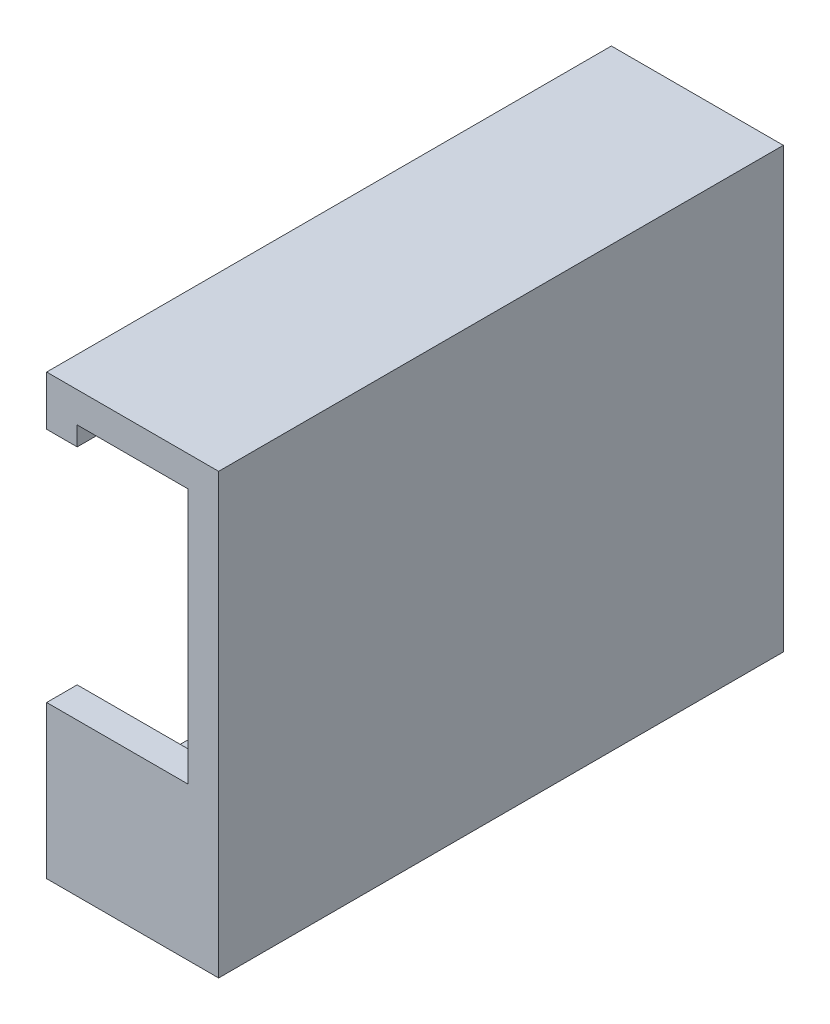
ISO-10303-21;
HEADER;
FILE_DESCRIPTION(('STEP AP214'),'2;1');
FILE_NAME('part.step','',(''),(''),'','','');
FILE_SCHEMA(('AUTOMOTIVE_DESIGN { 1 0 10303 214 1 1 1 1 }'));
ENDSEC;
DATA;
#1=APPLICATION_CONTEXT('core data for automotive mechanical design processes');
#2=APPLICATION_PROTOCOL_DEFINITION('international standard','automotive_design',2000,#1);
#3=PRODUCT_CONTEXT('',#1,'mechanical');
#4=PRODUCT('Part','Part','',(#3));
#5=PRODUCT_RELATED_PRODUCT_CATEGORY('part','',(#4));
#6=PRODUCT_DEFINITION_FORMATION('','',#4);
#7=PRODUCT_DEFINITION_CONTEXT('part definition',#1,'design');
#8=PRODUCT_DEFINITION('design','',#6,#7);
#9=PRODUCT_DEFINITION_SHAPE('','',#8);
#10=(LENGTH_UNIT() NAMED_UNIT(*) SI_UNIT(.MILLI.,.METRE.));
#11=(NAMED_UNIT(*) PLANE_ANGLE_UNIT() SI_UNIT($,.RADIAN.));
#12=(NAMED_UNIT(*) SI_UNIT($,.STERADIAN.) SOLID_ANGLE_UNIT());
#13=UNCERTAINTY_MEASURE_WITH_UNIT(LENGTH_MEASURE(1.E-05),#10,'distance_accuracy_value','');
#14=(GEOMETRIC_REPRESENTATION_CONTEXT(3) GLOBAL_UNCERTAINTY_ASSIGNED_CONTEXT((#13)) GLOBAL_UNIT_ASSIGNED_CONTEXT((#10,
#11,#12)) REPRESENTATION_CONTEXT('',''));
#15=CARTESIAN_POINT('',(0.,0.,0.));
#16=DIRECTION('',(0.,0.,1.));
#17=DIRECTION('',(1.,0.,0.));
#18=AXIS2_PLACEMENT_3D('',#15,#16,#17);
#19=CARTESIAN_POINT('',(0.,0.,93.98));
#20=DIRECTION('',(0.,1.,0.));
#21=DIRECTION('',(-1.,0.,0.));
#22=AXIS2_PLACEMENT_3D('',#19,#20,#21);
#23=PLANE('',#22);
#24=DIRECTION('',(0.,0.,-1.));
#25=VECTOR('',#24,1.);
#26=CARTESIAN_POINT('',(-18.462498,0.,93.98));
#27=LINE('',#26,#25);
#28=CARTESIAN_POINT('',(-18.462498,0.,88.9));
#29=VERTEX_POINT('',#28);
#30=CARTESIAN_POINT('',(-18.462498,0.,0.));
#31=VERTEX_POINT('',#30);
#32=EDGE_CURVE('E231',#29,#31,#27,.T.);
#33=ORIENTED_EDGE('',*,*,#32,.F.);
#34=DIRECTION('',(1.,0.,0.));
#35=VECTOR('',#34,1.);
#36=CARTESIAN_POINT('',(0.,0.,88.9));
#37=LINE('',#36,#35);
#38=CARTESIAN_POINT('',(0.,0.,88.9));
#39=VERTEX_POINT('',#38);
#40=EDGE_CURVE('E54',#29,#39,#37,.T.);
#41=ORIENTED_EDGE('',*,*,#40,.T.);
#42=DIRECTION('',(0.,0.,-1.));
#43=VECTOR('',#42,1.);
#44=CARTESIAN_POINT('',(0.,0.,93.98));
#45=LINE('',#44,#43);
#46=CARTESIAN_POINT('',(0.,0.,0.));
#47=VERTEX_POINT('',#46);
#48=EDGE_CURVE('E233',#39,#47,#45,.T.);
#49=ORIENTED_EDGE('',*,*,#48,.T.);
#50=DIRECTION('',(1.,0.,0.));
#51=VECTOR('',#50,1.);
#52=CARTESIAN_POINT('',(0.,0.,0.));
#53=LINE('',#52,#51);
#54=EDGE_CURVE('E200',#31,#47,#53,.T.);
#55=ORIENTED_EDGE('',*,*,#54,.F.);
#56=EDGE_LOOP('',(#33,#41,#49,#55));
#57=FACE_BOUND('',#56,.T.);
#58=ADVANCED_FACE('F31',(#57),#23,.T.);
#59=CARTESIAN_POINT('',(-18.462498,0.,93.98));
#60=DIRECTION('',(1.,0.,0.));
#61=DIRECTION('',(0.,0.,-1.));
#62=AXIS2_PLACEMENT_3D('',#59,#60,#61);
#63=PLANE('',#62);
#64=DIRECTION('',(0.,0.,-1.));
#65=VECTOR('',#64,1.);
#66=CARTESIAN_POINT('',(-18.462498,3.175,93.98));
#67=LINE('',#66,#65);
#68=CARTESIAN_POINT('',(-18.462498,3.175,88.9));
#69=VERTEX_POINT('',#68);
#70=CARTESIAN_POINT('',(-18.462498,3.175,0.));
#71=VERTEX_POINT('',#70);
#72=EDGE_CURVE('E229',#69,#71,#67,.T.);
#73=ORIENTED_EDGE('',*,*,#72,.F.);
#74=DIRECTION('',(0.,-1.,0.));
#75=VECTOR('',#74,1.);
#76=CARTESIAN_POINT('',(-18.462498,0.,88.9));
#77=LINE('',#76,#75);
#78=EDGE_CURVE('E159',#69,#29,#77,.T.);
#79=ORIENTED_EDGE('',*,*,#78,.T.);
#80=ORIENTED_EDGE('',*,*,#32,.T.);
#81=DIRECTION('',(0.,-1.,0.));
#82=VECTOR('',#81,1.);
#83=CARTESIAN_POINT('',(-18.462498,0.,0.));
#84=LINE('',#83,#82);
#85=EDGE_CURVE('E203',#71,#31,#84,.T.);
#86=ORIENTED_EDGE('',*,*,#85,.F.);
#87=EDGE_LOOP('',(#73,#79,#80,#86));
#88=FACE_BOUND('',#87,.T.);
#89=ADVANCED_FACE('F283',(#88),#63,.T.);
#90=CARTESIAN_POINT('',(-23.542498,3.175,93.98));
#91=DIRECTION('',(0.,1.,0.));
#92=DIRECTION('',(0.,0.,1.));
#93=AXIS2_PLACEMENT_3D('',#90,#91,#92);
#94=PLANE('',#93);
#95=DIRECTION('',(0.,0.,-1.));
#96=VECTOR('',#95,1.);
#97=CARTESIAN_POINT('',(-23.542498,3.175,93.98));
#98=LINE('',#97,#96);
#99=CARTESIAN_POINT('',(-23.542498,3.175,88.9));
#100=VERTEX_POINT('',#99);
#101=CARTESIAN_POINT('',(-23.542498,3.175,0.));
#102=VERTEX_POINT('',#101);
#103=EDGE_CURVE('E227',#100,#102,#98,.T.);
#104=ORIENTED_EDGE('',*,*,#103,.F.);
#105=DIRECTION('',(1.,0.,0.));
#106=VECTOR('',#105,1.);
#107=CARTESIAN_POINT('',(-23.542498,3.175,88.9));
#108=LINE('',#107,#106);
#109=EDGE_CURVE('E153',#100,#69,#108,.T.);
#110=ORIENTED_EDGE('',*,*,#109,.T.);
#111=ORIENTED_EDGE('',*,*,#72,.T.);
#112=DIRECTION('',(1.,0.,0.));
#113=VECTOR('',#112,1.);
#114=CARTESIAN_POINT('',(-23.542498,3.175,0.));
#115=LINE('',#114,#113);
#116=EDGE_CURVE('E206',#102,#71,#115,.T.);
#117=ORIENTED_EDGE('',*,*,#116,.F.);
#118=EDGE_LOOP('',(#104,#110,#111,#117));
#119=FACE_BOUND('',#118,.T.);
#120=ADVANCED_FACE('F279',(#119),#94,.T.);
#121=CARTESIAN_POINT('',(-23.542498,62.865,93.98));
#122=DIRECTION('',(1.,0.,0.));
#123=DIRECTION('',(0.,1.,0.));
#124=AXIS2_PLACEMENT_3D('',#121,#122,#123);
#125=PLANE('',#124);
#126=DIRECTION('',(0.,-1.,0.));
#127=VECTOR('',#126,1.);
#128=CARTESIAN_POINT('',(-23.542498,62.865,0.));
#129=LINE('',#128,#127);
#130=CARTESIAN_POINT('',(-23.542498,67.945,0.));
#131=VERTEX_POINT('',#130);
#132=CARTESIAN_POINT('',(-23.542498,59.69,0.));
#133=VERTEX_POINT('',#132);
#134=EDGE_CURVE('E163',#131,#133,#129,.T.);
#135=ORIENTED_EDGE('',*,*,#134,.T.);
#136=DIRECTION('',(0.,0.,-1.));
#137=VECTOR('',#136,1.);
#138=CARTESIAN_POINT('',(-23.542498,59.69,93.98));
#139=LINE('',#138,#137);
#140=CARTESIAN_POINT('',(-23.542498,59.69,93.98));
#141=VERTEX_POINT('',#140);
#142=EDGE_CURVE('E11',#141,#133,#139,.T.);
#143=ORIENTED_EDGE('',*,*,#142,.F.);
#144=DIRECTION('',(0.,-1.,0.));
#145=VECTOR('',#144,1.);
#146=CARTESIAN_POINT('',(-23.542498,62.865,93.98));
#147=LINE('',#146,#145);
#148=CARTESIAN_POINT('',(-23.542498,67.945,93.98));
#149=VERTEX_POINT('',#148);
#150=EDGE_CURVE('E164',#149,#141,#147,.T.);
#151=ORIENTED_EDGE('',*,*,#150,.F.);
#152=DIRECTION('',(0.,0.,-1.));
#153=VECTOR('',#152,1.);
#154=CARTESIAN_POINT('',(-23.542498,67.945,93.98));
#155=LINE('',#154,#153);
#156=EDGE_CURVE('E185',#149,#131,#155,.T.);
#157=ORIENTED_EDGE('',*,*,#156,.T.);
#158=EDGE_LOOP('',(#135,#143,#151,#157));
#159=FACE_BOUND('',#158,.T.);
#160=ADVANCED_FACE('F33',(#159),#125,.F.);
#161=CARTESIAN_POINT('',(-18.462498,59.69,93.98));
#162=DIRECTION('',(0.,-1.,0.));
#163=DIRECTION('',(0.,0.,-1.));
#164=AXIS2_PLACEMENT_3D('',#161,#162,#163);
#165=PLANE('',#164);
#166=DIRECTION('',(-1.,0.,0.));
#167=VECTOR('',#166,1.);
#168=CARTESIAN_POINT('',(-18.462498,59.69,0.));
#169=LINE('',#168,#167);
#170=CARTESIAN_POINT('',(-18.462498,59.69,0.));
#171=VERTEX_POINT('',#170);
#172=EDGE_CURVE('E188',#171,#133,#169,.T.);
#173=ORIENTED_EDGE('',*,*,#172,.F.);
#174=DIRECTION('',(0.,0.,-1.));
#175=VECTOR('',#174,1.);
#176=CARTESIAN_POINT('',(-18.462498,59.69,93.98));
#177=LINE('',#176,#175);
#178=CARTESIAN_POINT('',(-18.462498,59.69,93.98));
#179=VERTEX_POINT('',#178);
#180=EDGE_CURVE('E39',#179,#171,#177,.T.);
#181=ORIENTED_EDGE('',*,*,#180,.F.);
#182=DIRECTION('',(-1.,0.,0.));
#183=VECTOR('',#182,1.);
#184=CARTESIAN_POINT('',(-18.462498,59.69,93.98));
#185=LINE('',#184,#183);
#186=EDGE_CURVE('E166',#179,#141,#185,.T.);
#187=ORIENTED_EDGE('',*,*,#186,.T.);
#188=ORIENTED_EDGE('',*,*,#142,.T.);
#189=EDGE_LOOP('',(#173,#181,#187,#188));
#190=FACE_BOUND('',#189,.T.);
#191=ADVANCED_FACE('F245',(#190),#165,.T.);
#192=CARTESIAN_POINT('',(-18.462498,62.865,93.98));
#193=DIRECTION('',(1.,0.,0.));
#194=DIRECTION('',(0.,1.,0.));
#195=AXIS2_PLACEMENT_3D('',#192,#193,#194);
#196=PLANE('',#195);
#197=DIRECTION('',(0.,-1.,0.));
#198=VECTOR('',#197,1.);
#199=CARTESIAN_POINT('',(-18.462498,62.865,0.));
#200=LINE('',#199,#198);
#201=CARTESIAN_POINT('',(-18.462498,62.865,0.));
#202=VERTEX_POINT('',#201);
#203=EDGE_CURVE('E191',#202,#171,#200,.T.);
#204=ORIENTED_EDGE('',*,*,#203,.F.);
#205=DIRECTION('',(0.,0.,-1.));
#206=VECTOR('',#205,1.);
#207=CARTESIAN_POINT('',(-18.462498,62.865,93.98));
#208=LINE('',#207,#206);
#209=CARTESIAN_POINT('',(-18.462498,62.865,93.98));
#210=VERTEX_POINT('',#209);
#211=EDGE_CURVE('E237',#210,#202,#208,.T.);
#212=ORIENTED_EDGE('',*,*,#211,.F.);
#213=DIRECTION('',(0.,-1.,0.));
#214=VECTOR('',#213,1.);
#215=CARTESIAN_POINT('',(-18.462498,62.865,93.98));
#216=LINE('',#215,#214);
#217=EDGE_CURVE('E170',#210,#179,#216,.T.);
#218=ORIENTED_EDGE('',*,*,#217,.T.);
#219=ORIENTED_EDGE('',*,*,#180,.T.);
#220=EDGE_LOOP('',(#204,#212,#218,#219));
#221=FACE_BOUND('',#220,.T.);
#222=ADVANCED_FACE('F241',(#221),#196,.T.);
#223=CARTESIAN_POINT('',(-18.462498,62.865,93.98));
#224=DIRECTION('',(0.,-1.,0.));
#225=DIRECTION('',(0.,0.,-1.));
#226=AXIS2_PLACEMENT_3D('',#223,#224,#225);
#227=PLANE('',#226);
#228=DIRECTION('',(-1.,0.,0.));
#229=VECTOR('',#228,1.);
#230=CARTESIAN_POINT('',(-18.462498,62.865,0.));
#231=LINE('',#230,#229);
#232=CARTESIAN_POINT('',(0.,62.865,0.));
#233=VERTEX_POINT('',#232);
#234=EDGE_CURVE('E194',#233,#202,#231,.T.);
#235=ORIENTED_EDGE('',*,*,#234,.F.);
#236=DIRECTION('',(0.,0.,-1.));
#237=VECTOR('',#236,1.);
#238=CARTESIAN_POINT('',(0.,62.865,93.98));
#239=LINE('',#238,#237);
#240=CARTESIAN_POINT('',(0.,62.865,93.98));
#241=VERTEX_POINT('',#240);
#242=EDGE_CURVE('E235',#241,#233,#239,.T.);
#243=ORIENTED_EDGE('',*,*,#242,.F.);
#244=DIRECTION('',(-1.,0.,0.));
#245=VECTOR('',#244,1.);
#246=CARTESIAN_POINT('',(-18.462498,62.865,93.98));
#247=LINE('',#246,#245);
#248=EDGE_CURVE('E173',#241,#210,#247,.T.);
#249=ORIENTED_EDGE('',*,*,#248,.T.);
#250=ORIENTED_EDGE('',*,*,#211,.T.);
#251=EDGE_LOOP('',(#235,#243,#249,#250));
#252=FACE_BOUND('',#251,.T.);
#253=ADVANCED_FACE('F254',(#252),#227,.T.);
#254=CARTESIAN_POINT('',(0.,62.865,93.98));
#255=DIRECTION('',(-1.,0.,0.));
#256=DIRECTION('',(0.,-1.,0.));
#257=AXIS2_PLACEMENT_3D('',#254,#255,#256);
#258=PLANE('',#257);
#259=DIRECTION('',(0.,0.,-1.));
#260=VECTOR('',#259,1.);
#261=CARTESIAN_POINT('',(0.,20.32,93.98));
#262=LINE('',#261,#260);
#263=CARTESIAN_POINT('',(0.,20.32,93.98));
#264=VERTEX_POINT('',#263);
#265=CARTESIAN_POINT('',(0.,20.32,88.9));
#266=VERTEX_POINT('',#265);
#267=EDGE_CURVE('E137',#264,#266,#262,.T.);
#268=ORIENTED_EDGE('',*,*,#267,.F.);
#269=DIRECTION('',(0.,1.,0.));
#270=VECTOR('',#269,1.);
#271=CARTESIAN_POINT('',(0.,62.865,93.98));
#272=LINE('',#271,#270);
#273=EDGE_CURVE('E176',#264,#241,#272,.T.);
#274=ORIENTED_EDGE('',*,*,#273,.T.);
#275=ORIENTED_EDGE('',*,*,#242,.T.);
#276=DIRECTION('',(0.,1.,0.));
#277=VECTOR('',#276,1.);
#278=CARTESIAN_POINT('',(0.,62.865,0.));
#279=LINE('',#278,#277);
#280=EDGE_CURVE('E197',#47,#233,#279,.T.);
#281=ORIENTED_EDGE('',*,*,#280,.F.);
#282=ORIENTED_EDGE('',*,*,#48,.F.);
#283=DIRECTION('',(0.,1.,0.));
#284=VECTOR('',#283,1.);
#285=CARTESIAN_POINT('',(0.,62.865,88.9));
#286=LINE('',#285,#284);
#287=EDGE_CURVE('E46',#39,#266,#286,.T.);
#288=ORIENTED_EDGE('',*,*,#287,.T.);
#289=EDGE_LOOP('',(#268,#274,#275,#281,#282,#288));
#290=FACE_BOUND('',#289,.T.);
#291=ADVANCED_FACE('F285',(#290),#258,.T.);
#292=CARTESIAN_POINT('',(-23.542498,0.,93.98));
#293=DIRECTION('',(1.,0.,0.));
#294=DIRECTION('',(0.,0.,-1.));
#295=AXIS2_PLACEMENT_3D('',#292,#293,#294);
#296=PLANE('',#295);
#297=DIRECTION('',(0.,1.,0.));
#298=VECTOR('',#297,1.);
#299=CARTESIAN_POINT('',(-23.542498,0.,93.98));
#300=LINE('',#299,#298);
#301=CARTESIAN_POINT('',(-23.542498,20.32,93.98));
#302=VERTEX_POINT('',#301);
#303=CARTESIAN_POINT('',(-23.542498,-5.08,93.98));
#304=VERTEX_POINT('',#303);
#305=EDGE_CURVE('E147',#302,#304,#300,.F.);
#306=ORIENTED_EDGE('',*,*,#305,.F.);
#307=DIRECTION('',(0.,0.,1.));
#308=VECTOR('',#307,1.);
#309=CARTESIAN_POINT('',(-23.542498,20.32,88.9));
#310=LINE('',#309,#308);
#311=CARTESIAN_POINT('',(-23.542498,20.32,88.9));
#312=VERTEX_POINT('',#311);
#313=EDGE_CURVE('E136',#312,#302,#310,.T.);
#314=ORIENTED_EDGE('',*,*,#313,.F.);
#315=DIRECTION('',(0.,-1.,0.));
#316=VECTOR('',#315,1.);
#317=CARTESIAN_POINT('',(-23.542498,-5.08,88.9));
#318=LINE('',#317,#316);
#319=EDGE_CURVE('E140',#312,#100,#318,.T.);
#320=ORIENTED_EDGE('',*,*,#319,.T.);
#321=ORIENTED_EDGE('',*,*,#103,.T.);
#322=DIRECTION('',(0.,1.,0.));
#323=VECTOR('',#322,1.);
#324=CARTESIAN_POINT('',(-23.542498,0.,0.));
#325=LINE('',#324,#323);
#326=CARTESIAN_POINT('',(-23.542498,-5.08,0.));
#327=VERTEX_POINT('',#326);
#328=EDGE_CURVE('E209',#102,#327,#325,.F.);
#329=ORIENTED_EDGE('',*,*,#328,.T.);
#330=DIRECTION('',(0.,0.,-1.));
#331=VECTOR('',#330,1.);
#332=CARTESIAN_POINT('',(-23.542498,-5.08,93.98));
#333=LINE('',#332,#331);
#334=EDGE_CURVE('E225',#304,#327,#333,.T.);
#335=ORIENTED_EDGE('',*,*,#334,.F.);
#336=EDGE_LOOP('',(#306,#314,#320,#321,#329,#335));
#337=FACE_BOUND('',#336,.T.);
#338=ADVANCED_FACE('F145',(#337),#296,.F.);
#339=CARTESIAN_POINT('',(0.,-5.08,93.98));
#340=DIRECTION('',(0.,1.,0.));
#341=DIRECTION('',(-1.,0.,0.));
#342=AXIS2_PLACEMENT_3D('',#339,#340,#341);
#343=PLANE('',#342);
#344=ORIENTED_EDGE('',*,*,#334,.T.);
#345=DIRECTION('',(1.,0.,0.));
#346=VECTOR('',#345,1.);
#347=CARTESIAN_POINT('',(0.,-5.08,0.));
#348=LINE('',#347,#346);
#349=CARTESIAN_POINT('',(5.08,-5.08,0.));
#350=VERTEX_POINT('',#349);
#351=EDGE_CURVE('E212',#327,#350,#348,.T.);
#352=ORIENTED_EDGE('',*,*,#351,.T.);
#353=DIRECTION('',(0.,0.,-1.));
#354=VECTOR('',#353,1.);
#355=CARTESIAN_POINT('',(5.08,-5.08,93.98));
#356=LINE('',#355,#354);
#357=CARTESIAN_POINT('',(5.08,-5.08,93.98));
#358=VERTEX_POINT('',#357);
#359=EDGE_CURVE('E223',#358,#350,#356,.T.);
#360=ORIENTED_EDGE('',*,*,#359,.F.);
#361=DIRECTION('',(1.,0.,0.));
#362=VECTOR('',#361,1.);
#363=CARTESIAN_POINT('',(0.,-5.08,93.98));
#364=LINE('',#363,#362);
#365=EDGE_CURVE('E179',#304,#358,#364,.T.);
#366=ORIENTED_EDGE('',*,*,#365,.F.);
#367=EDGE_LOOP('',(#344,#352,#360,#366));
#368=FACE_BOUND('',#367,.T.);
#369=ADVANCED_FACE('F275',(#368),#343,.F.);
#370=CARTESIAN_POINT('',(5.08,62.865,93.98));
#371=DIRECTION('',(-1.,0.,0.));
#372=DIRECTION('',(0.,-1.,0.));
#373=AXIS2_PLACEMENT_3D('',#370,#371,#372);
#374=PLANE('',#373);
#375=DIRECTION('',(0.,0.,-1.));
#376=VECTOR('',#375,1.);
#377=CARTESIAN_POINT('',(5.08,67.945,93.98));
#378=LINE('',#377,#376);
#379=CARTESIAN_POINT('',(5.08,67.945,93.98));
#380=VERTEX_POINT('',#379);
#381=CARTESIAN_POINT('',(5.08,67.945,0.));
#382=VERTEX_POINT('',#381);
#383=EDGE_CURVE('E220',#380,#382,#378,.T.);
#384=ORIENTED_EDGE('',*,*,#383,.F.);
#385=DIRECTION('',(0.,1.,0.));
#386=VECTOR('',#385,1.);
#387=CARTESIAN_POINT('',(5.08,62.865,93.98));
#388=LINE('',#387,#386);
#389=EDGE_CURVE('E181',#358,#380,#388,.T.);
#390=ORIENTED_EDGE('',*,*,#389,.F.);
#391=ORIENTED_EDGE('',*,*,#359,.T.);
#392=DIRECTION('',(0.,1.,0.));
#393=VECTOR('',#392,1.);
#394=CARTESIAN_POINT('',(5.08,62.865,0.));
#395=LINE('',#394,#393);
#396=EDGE_CURVE('E215',#350,#382,#395,.T.);
#397=ORIENTED_EDGE('',*,*,#396,.T.);
#398=EDGE_LOOP('',(#384,#390,#391,#397));
#399=FACE_BOUND('',#398,.T.);
#400=ADVANCED_FACE('F271',(#399),#374,.F.);
#401=CARTESIAN_POINT('',(-18.462498,67.945,93.98));
#402=DIRECTION('',(0.,-1.,0.));
#403=DIRECTION('',(0.,0.,-1.));
#404=AXIS2_PLACEMENT_3D('',#401,#402,#403);
#405=PLANE('',#404);
#406=DIRECTION('',(1.,0.,0.));
#407=VECTOR('',#406,1.);
#408=CARTESIAN_POINT('',(-18.462498,67.945,0.));
#409=LINE('',#408,#407);
#410=EDGE_CURVE('E167',#382,#131,#409,.F.);
#411=ORIENTED_EDGE('',*,*,#410,.T.);
#412=ORIENTED_EDGE('',*,*,#156,.F.);
#413=DIRECTION('',(1.,0.,0.));
#414=VECTOR('',#413,1.);
#415=CARTESIAN_POINT('',(-18.462498,67.945,93.98));
#416=LINE('',#415,#414);
#417=EDGE_CURVE('E183',#380,#149,#416,.F.);
#418=ORIENTED_EDGE('',*,*,#417,.F.);
#419=ORIENTED_EDGE('',*,*,#383,.T.);
#420=EDGE_LOOP('',(#411,#412,#418,#419));
#421=FACE_BOUND('',#420,.T.);
#422=ADVANCED_FACE('F267',(#421),#405,.F.);
#423=CARTESIAN_POINT('',(-23.542498,59.69,93.98));
#424=DIRECTION('',(0.,0.,-1.));
#425=DIRECTION('',(-1.,0.,0.));
#426=AXIS2_PLACEMENT_3D('',#423,#424,#425);
#427=PLANE('',#426);
#428=ORIENTED_EDGE('',*,*,#273,.F.);
#429=DIRECTION('',(-1.,0.,0.));
#430=VECTOR('',#429,1.);
#431=CARTESIAN_POINT('',(5.08,20.32,93.98));
#432=LINE('',#431,#430);
#433=EDGE_CURVE('E141',#264,#302,#432,.T.);
#434=ORIENTED_EDGE('',*,*,#433,.T.);
#435=ORIENTED_EDGE('',*,*,#305,.T.);
#436=ORIENTED_EDGE('',*,*,#365,.T.);
#437=ORIENTED_EDGE('',*,*,#389,.T.);
#438=ORIENTED_EDGE('',*,*,#417,.T.);
#439=ORIENTED_EDGE('',*,*,#150,.T.);
#440=ORIENTED_EDGE('',*,*,#186,.F.);
#441=ORIENTED_EDGE('',*,*,#217,.F.);
#442=ORIENTED_EDGE('',*,*,#248,.F.);
#443=EDGE_LOOP('',(#428,#434,#435,#436,#437,#438,#439,#440,#441,#442));
#444=FACE_BOUND('',#443,.T.);
#445=ADVANCED_FACE('F258',(#444),#427,.F.);
#446=CARTESIAN_POINT('',(-23.542498,59.69,0.));
#447=DIRECTION('',(0.,0.,-1.));
#448=DIRECTION('',(-1.,0.,0.));
#449=AXIS2_PLACEMENT_3D('',#446,#447,#448);
#450=PLANE('',#449);
#451=ORIENTED_EDGE('',*,*,#134,.F.);
#452=ORIENTED_EDGE('',*,*,#410,.F.);
#453=ORIENTED_EDGE('',*,*,#396,.F.);
#454=ORIENTED_EDGE('',*,*,#351,.F.);
#455=ORIENTED_EDGE('',*,*,#328,.F.);
#456=ORIENTED_EDGE('',*,*,#116,.T.);
#457=ORIENTED_EDGE('',*,*,#85,.T.);
#458=ORIENTED_EDGE('',*,*,#54,.T.);
#459=ORIENTED_EDGE('',*,*,#280,.T.);
#460=ORIENTED_EDGE('',*,*,#234,.T.);
#461=ORIENTED_EDGE('',*,*,#203,.T.);
#462=ORIENTED_EDGE('',*,*,#172,.T.);
#463=EDGE_LOOP('',(#451,#452,#453,#454,#455,#456,#457,#458,#459,#460,#461,#462));
#464=FACE_BOUND('',#463,.T.);
#465=ADVANCED_FACE('F249',(#464),#450,.T.);
#466=CARTESIAN_POINT('',(5.08,20.32,88.9));
#467=DIRECTION('',(0.,1.,0.));
#468=DIRECTION('',(-1.,0.,0.));
#469=AXIS2_PLACEMENT_3D('',#466,#467,#468);
#470=PLANE('',#469);
#471=ORIENTED_EDGE('',*,*,#433,.F.);
#472=ORIENTED_EDGE('',*,*,#267,.T.);
#473=DIRECTION('',(-1.,0.,0.));
#474=VECTOR('',#473,1.);
#475=CARTESIAN_POINT('',(5.08,20.32,88.9));
#476=LINE('',#475,#474);
#477=EDGE_CURVE('E132',#266,#312,#476,.T.);
#478=ORIENTED_EDGE('',*,*,#477,.T.);
#479=ORIENTED_EDGE('',*,*,#313,.T.);
#480=EDGE_LOOP('',(#471,#472,#478,#479));
#481=FACE_BOUND('',#480,.T.);
#482=ADVANCED_FACE('F135',(#481),#470,.T.);
#483=CARTESIAN_POINT('',(5.08,20.32,88.9));
#484=DIRECTION('',(0.,0.,1.));
#485=DIRECTION('',(1.,0.,0.));
#486=AXIS2_PLACEMENT_3D('',#483,#484,#485);
#487=PLANE('',#486);
#488=ORIENTED_EDGE('',*,*,#287,.F.);
#489=ORIENTED_EDGE('',*,*,#40,.F.);
#490=ORIENTED_EDGE('',*,*,#78,.F.);
#491=ORIENTED_EDGE('',*,*,#109,.F.);
#492=ORIENTED_EDGE('',*,*,#319,.F.);
#493=ORIENTED_EDGE('',*,*,#477,.F.);
#494=EDGE_LOOP('',(#488,#489,#490,#491,#492,#493));
#495=FACE_BOUND('',#494,.T.);
#496=ADVANCED_FACE('F151',(#495),#487,.F.);
#497=CLOSED_SHELL('',(#58,#89,#120,#160,#191,#222,#253,#291,#338,#369,#400,#422,#445,#465,#482,#496));
#498=MANIFOLD_SOLID_BREP('B2',#497);
#499=ADVANCED_BREP_SHAPE_REPRESENTATION('',(#18,#498),#14);
#500=SHAPE_DEFINITION_REPRESENTATION(#9,#499);
ENDSEC;
END-ISO-10303-21;
